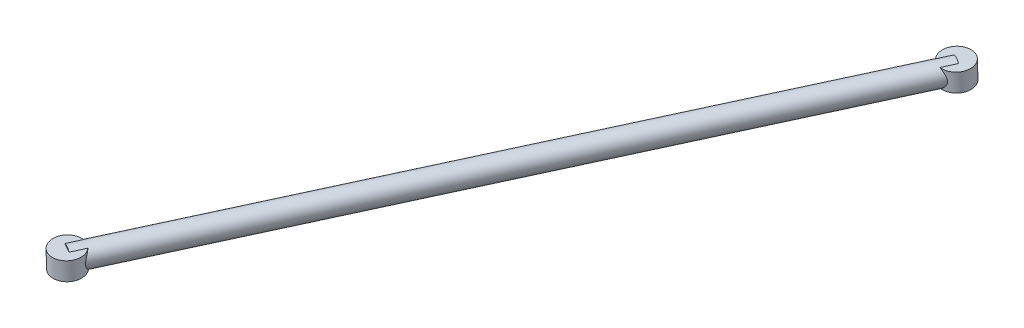
ISO-10303-21;
HEADER;
FILE_DESCRIPTION(('STEP AP214'),'2;1');
FILE_NAME('part.step','',(''),(''),'','','');
FILE_SCHEMA(('AUTOMOTIVE_DESIGN { 1 0 10303 214 1 1 1 1 }'));
ENDSEC;
DATA;
#1=APPLICATION_CONTEXT('core data for automotive mechanical design processes');
#2=APPLICATION_PROTOCOL_DEFINITION('international standard','automotive_design',2000,#1);
#3=PRODUCT_CONTEXT('',#1,'mechanical');
#4=PRODUCT('Part','Part','',(#3));
#5=PRODUCT_RELATED_PRODUCT_CATEGORY('part','',(#4));
#6=PRODUCT_DEFINITION_FORMATION('','',#4);
#7=PRODUCT_DEFINITION_CONTEXT('part definition',#1,'design');
#8=PRODUCT_DEFINITION('design','',#6,#7);
#9=PRODUCT_DEFINITION_SHAPE('','',#8);
#10=(LENGTH_UNIT() NAMED_UNIT(*) SI_UNIT(.MILLI.,.METRE.));
#11=(NAMED_UNIT(*) PLANE_ANGLE_UNIT() SI_UNIT($,.RADIAN.));
#12=(NAMED_UNIT(*) SI_UNIT($,.STERADIAN.) SOLID_ANGLE_UNIT());
#13=UNCERTAINTY_MEASURE_WITH_UNIT(LENGTH_MEASURE(1.E-05),#10,'distance_accuracy_value','');
#14=(GEOMETRIC_REPRESENTATION_CONTEXT(3) GLOBAL_UNCERTAINTY_ASSIGNED_CONTEXT((#13)) GLOBAL_UNIT_ASSIGNED_CONTEXT((#10,
#11,#12)) REPRESENTATION_CONTEXT('',''));
#15=CARTESIAN_POINT('',(0.,0.,0.));
#16=DIRECTION('',(0.,0.,1.));
#17=DIRECTION('',(1.,0.,0.));
#18=AXIS2_PLACEMENT_3D('',#15,#16,#17);
#19=CARTESIAN_POINT('',(-535.6,-114.51,-83.23));
#20=DIRECTION('',(0.464028683221349,0.0373067621610558,-0.885034229080954));
#21=DIRECTION('',(-0.885650765612241,0.,-0.464351936972866));
#22=AXIS2_PLACEMENT_3D('',#19,#20,#21);
#23=CYLINDRICAL_SURFACE('',#22,7.99999999999999);
#24=CARTESIAN_POINT('',(-527.527885217287,-121.275148551619,-90.9159437152939));
#25=CARTESIAN_POINT('',(-527.375216967127,-121.16999834848,-90.7415729183805));
#26=CARTESIAN_POINT('',(-527.230713424284,-121.056049329631,-90.5655522286834));
#27=CARTESIAN_POINT('',(-526.957681962772,-120.81185477697,-90.212711093261));
#28=CARTESIAN_POINT('',(-526.829140586321,-120.681623159602,-90.0358914533091));
#29=CARTESIAN_POINT('',(-526.587030323763,-120.405535202328,-89.6830775517052));
#30=CARTESIAN_POINT('',(-526.473511318909,-120.259629585795,-89.5070878230809));
#31=CARTESIAN_POINT('',(-526.261190648435,-119.953373275566,-89.1587749783426));
#32=CARTESIAN_POINT('',(-526.162392259245,-119.79301937876,-88.9864526857994));
#33=CARTESIAN_POINT('',(-525.979000634195,-119.458950893481,-88.6483799497242));
#34=CARTESIAN_POINT('',(-525.894368635894,-119.285274724236,-88.4826125535662));
#35=CARTESIAN_POINT('',(-525.738139016313,-118.92448603525,-88.1597396815241));
#36=CARTESIAN_POINT('',(-525.666542438499,-118.737372441533,-88.0026348997711));
#37=CARTESIAN_POINT('',(-525.535660945902,-118.35011111088,-87.700332495782));
#38=CARTESIAN_POINT('',(-525.476357867854,-118.149983185332,-87.5551175016211));
#39=CARTESIAN_POINT('',(-525.369187165174,-117.736726806719,-87.2800177749206));
#40=CARTESIAN_POINT('',(-525.321314214353,-117.523604467116,-87.1501259164655));
#41=CARTESIAN_POINT('',(-525.220905340081,-117.005163343979,-86.8664856557675));
#42=CARTESIAN_POINT('',(-525.172888371712,-116.694260713984,-86.7209672018812));
#43=CARTESIAN_POINT('',(-525.114725832974,-116.21294777,-86.5391840975553));
#44=CARTESIAN_POINT('',(-525.097653952323,-116.050103274001,-86.4846905484392));
#45=CARTESIAN_POINT('',(-525.067983414312,-115.720126230593,-86.3892391182557));
#46=CARTESIAN_POINT('',(-525.055382482164,-115.552995910332,-86.3482743545684));
#47=CARTESIAN_POINT('',(-525.034489759088,-115.214073448259,-86.2807933711694));
#48=CARTESIAN_POINT('',(-525.026235723574,-115.042253669066,-86.2544036513258));
#49=CARTESIAN_POINT('',(-525.014177727793,-114.696762787163,-86.2173817185584));
#50=CARTESIAN_POINT('',(-525.01037367745,-114.523091721997,-86.2067491866789));
#51=CARTESIAN_POINT('',(-525.007241492019,-114.175411062443,-86.2013874072575));
#52=CARTESIAN_POINT('',(-525.007914905922,-114.00140137172,-86.2066636630577));
#53=CARTESIAN_POINT('',(-525.013812077609,-113.654628526125,-86.2326269089957));
#54=CARTESIAN_POINT('',(-525.019035874906,-113.48186538209,-86.2533140329538));
#55=CARTESIAN_POINT('',(-525.033395031565,-113.155944826445,-86.3062858622486));
#56=CARTESIAN_POINT('',(-525.042090445484,-113.002544148725,-86.3372148850445));
#57=CARTESIAN_POINT('',(-525.063369965508,-112.69853683852,-86.4097276529701));
#58=CARTESIAN_POINT('',(-525.075955471115,-112.547931232294,-86.4513152317032));
#59=CARTESIAN_POINT('',(-525.119761695371,-112.101019206346,-86.5904786707225));
#60=CARTESIAN_POINT('',(-525.157029450102,-111.809681115766,-86.7024441236241));
#61=CARTESIAN_POINT('',(-525.239092568228,-111.303499593709,-86.9289215766435));
#62=CARTESIAN_POINT('',(-525.280617075135,-111.085533277276,-87.0378614444939));
#63=CARTESIAN_POINT('',(-525.375117139174,-110.660033124723,-87.2704281836567));
#64=CARTESIAN_POINT('',(-525.428097877762,-110.452504061716,-87.3940616892163));
#65=CARTESIAN_POINT('',(-525.546322468348,-110.048113734813,-87.653031449403));
#66=CARTESIAN_POINT('',(-525.611584958013,-109.851269277639,-87.7883853190047));
#67=CARTESIAN_POINT('',(-525.755089913837,-109.468989712555,-88.0679827774139));
#68=CARTESIAN_POINT('',(-525.833331161646,-109.283553535957,-88.2122255309996));
#69=CARTESIAN_POINT('',(-526.001963212901,-108.928032829871,-88.5045188959517));
#70=CARTESIAN_POINT('',(-526.092095897669,-108.757724094072,-88.6524456805632));
#71=CARTESIAN_POINT('',(-526.286290163929,-108.429377870879,-88.952649738329));
#72=CARTESIAN_POINT('',(-526.390348795014,-108.271337795374,-89.1049260846071));
#73=CARTESIAN_POINT('',(-526.612772660962,-107.968823639291,-89.4115832164398));
#74=CARTESIAN_POINT('',(-526.731101481504,-107.824316633677,-89.5659577896629));
#75=CARTESIAN_POINT('',(-526.982804637205,-107.54955262444,-89.8753924805938));
#76=CARTESIAN_POINT('',(-527.116190632637,-107.419306820582,-90.0304530390079));
#77=CARTESIAN_POINT('',(-527.257280147067,-107.296869973545,-90.1848388523638));
#78=B_SPLINE_CURVE_WITH_KNOTS('',3,(#24,#25,#26,#27,#28,#29,#30,#31,#32,#33,#34,#35,#36,#37,#38,
#39,#40,#41,#42,#43,#44,#45,#46,#47,#48,#49,#50,#51,#52,#53,#54,#55,#56,#57,#58,#59,#60,#61,#62,
#63,#64,#65,#66,#67,#68,#69,#70,#71,#72,#73,#74,#75,#76,#77),.UNSPECIFIED.,.F.,.F.,(4,2,2,2,2,2,
2,2,2,2,2,2,2,2,2,2,2,2,2,2,2,2,2,2,2,2,4),(0.,0.763017342065591,1.52538694865108,
2.29022764606419,3.05523832385196,3.81812027380768,4.58106326455515,5.3428708678139,
6.104322789496,7.13972593898703,7.65690353137052,8.17381760861127,8.6951502840498,
9.21647240657152,9.73797489124056,10.2594819044262,10.7292013609395,11.1990900009191,
12.1390591859545,12.8797532323706,13.6207829853052,14.3629464602411,15.1050403056593,
15.8330818833562,16.5609694587008,17.287037440532,18.0136715971829),.UNSPECIFIED.);
#79=CARTESIAN_POINT('',(-527.527885217287,-121.275148551619,-90.9159437152939));
#80=VERTEX_POINT('',#79);
#81=CARTESIAN_POINT('',(-527.257280147067,-107.296869973545,-90.1848388523638));
#82=VERTEX_POINT('',#81);
#83=EDGE_CURVE('E234',#80,#82,#78,.T.);
#84=ORIENTED_EDGE('',*,*,#83,.F.);
#85=CARTESIAN_POINT('',(-525.605809580209,-121.120493383174,-94.5812600121603));
#86=CARTESIAN_POINT('',(-526.923411805572,-121.226511061254,-92.0686487210002));
#87=CARTESIAN_POINT('',(-528.241014048009,-121.332528738536,-89.5560374387595));
#88=CARTESIAN_POINT('',(-530.876218567029,-121.544564091501,-84.5308148921169));
#89=CARTESIAN_POINT('',(-532.193820843613,-121.650581767185,-82.0182036277149));
#90=CARTESIAN_POINT('',(-533.511423137269,-121.75659944207,-79.5055923722324));
#91=B_SPLINE_CURVE_WITH_KNOTS('',3,(#85,#86,#87,#88,#89,#90),.UNSPECIFIED.,.F.,.F.,(4,2,4),(0.,
8.51732222328871,17.0346444465774),.UNSPECIFIED.);
#92=CARTESIAN_POINT('',(-532.305987571475,-121.659606990461,-81.8043064836089));
#93=VERTEX_POINT('',#92);
#94=EDGE_CURVE('E145',#80,#93,#91,.T.);
#95=ORIENTED_EDGE('',*,*,#94,.T.);
#96=CARTESIAN_POINT('',(-535.6,-114.51,-83.23));
#97=DIRECTION('',(0.46402868322135,0.0373067621610557,-0.885034229080954));
#98=DIRECTION('',(-0.88565076561224,0.,-0.464351936972866));
#99=AXIS2_PLACEMENT_3D('',#96,#97,#98);
#100=CIRCLE('',#99,7.99999999999999);
#101=CARTESIAN_POINT('',(-539.16587162213,-121.338612903503,-85.3874534499272));
#102=VERTEX_POINT('',#101);
#103=EDGE_CURVE('E209',#93,#102,#100,.T.);
#104=ORIENTED_EDGE('',*,*,#103,.T.);
#105=CARTESIAN_POINT('',(-542.249262381519,-121.586813490172,-79.505592372232));
#106=CARTESIAN_POINT('',(-540.932100647346,-121.480787252857,-82.0182036633885));
#107=CARTESIAN_POINT('',(-539.614938896096,-121.374761016341,-84.5308149456274));
#108=CARTESIAN_POINT('',(-536.980615359446,-121.162708544907,-89.5560374922698));
#109=CARTESIAN_POINT('',(-535.663453574046,-121.056682309989,-92.0686487566733));
#110=CARTESIAN_POINT('',(-534.34629177157,-120.950656075869,-94.5812600121591));
#111=B_SPLINE_CURVE_WITH_KNOTS('',3,(#105,#106,#107,#108,#109,#110),.UNSPECIFIED.,.F.,.F.,(4,2,
4),(0.,8.51670997960846,17.0334199592169),.UNSPECIFIED.);
#112=CARTESIAN_POINT('',(-534.389023241594,-120.954095787557,-94.4997456740078));
#113=VERTEX_POINT('',#112);
#114=EDGE_CURVE('E240',#102,#113,#111,.T.);
#115=ORIENTED_EDGE('',*,*,#114,.T.);
#116=CARTESIAN_POINT('',(-534.115909924604,-106.975934577704,-93.7673306698655));
#117=CARTESIAN_POINT('',(-534.342408282804,-107.08697114778,-93.800913499756));
#118=CARTESIAN_POINT('',(-534.565311268226,-107.20717438187,-93.8274364813404));
#119=CARTESIAN_POINT('',(-535.002119177237,-107.464439135144,-93.8679829011694));
#120=CARTESIAN_POINT('',(-535.216031583525,-107.601486247056,-93.8820169382076));
#121=CARTESIAN_POINT('',(-535.634114657782,-107.891624281577,-93.8992849186253));
#122=CARTESIAN_POINT('',(-535.838251669916,-108.044765539055,-93.9024838721228));
#123=CARTESIAN_POINT('',(-536.234640013448,-108.365720544914,-93.8998225493848));
#124=CARTESIAN_POINT('',(-536.426888691802,-108.533537548361,-93.8939602585415));
#125=CARTESIAN_POINT('',(-536.797443050142,-108.882552159916,-93.8751705304315));
#126=CARTESIAN_POINT('',(-536.975786082447,-109.063711187852,-93.8622628217905));
#127=CARTESIAN_POINT('',(-537.317478002382,-109.439306564377,-93.8315320883297));
#128=CARTESIAN_POINT('',(-537.48082569222,-109.633743971449,-93.8137086713099));
#129=CARTESIAN_POINT('',(-537.790289285312,-110.03525676333,-93.7755507573749));
#130=CARTESIAN_POINT('',(-537.936430363266,-110.242312994798,-93.7552200204072));
#131=CARTESIAN_POINT('',(-538.209169972207,-110.668772660287,-93.7147030430963));
#132=CARTESIAN_POINT('',(-538.335777581919,-110.888170293201,-93.694516739809));
#133=CARTESIAN_POINT('',(-538.608122423583,-111.420383511729,-93.6505333179564));
#134=CARTESIAN_POINT('',(-538.744327816088,-111.738386522499,-93.6280539912031));
#135=CARTESIAN_POINT('',(-538.910247648475,-112.228390334609,-93.6046070384433));
#136=CARTESIAN_POINT('',(-538.959141139915,-112.393804338084,-93.5985038893332));
#137=CARTESIAN_POINT('',(-539.043113453196,-112.72817391574,-93.590574515162));
#138=CARTESIAN_POINT('',(-539.078199303758,-112.897127641786,-93.5887461117112));
#139=CARTESIAN_POINT('',(-539.133886511312,-113.238885843293,-93.5900440002986));
#140=CARTESIAN_POINT('',(-539.154361314968,-113.411710901017,-93.5932128369184));
#141=CARTESIAN_POINT('',(-539.179765677628,-113.758325168549,-93.6049469177375));
#142=CARTESIAN_POINT('',(-539.18469555274,-113.932114358679,-93.6135120521978));
#143=CARTESIAN_POINT('',(-539.178926641949,-114.279138376951,-93.6360012663199));
#144=CARTESIAN_POINT('',(-539.168222481065,-114.452372993908,-93.6499271878078));
#145=CARTESIAN_POINT('',(-539.13160171477,-114.796741422635,-93.6826938027065));
#146=CARTESIAN_POINT('',(-539.105684979233,-114.967875216423,-93.7015345381571));
#147=CARTESIAN_POINT('',(-539.04277328947,-115.289928692608,-93.7412787948852));
#148=CARTESIAN_POINT('',(-539.007136872182,-115.441165691304,-93.7617906583905));
#149=CARTESIAN_POINT('',(-538.924993724361,-115.740285942367,-93.8054742937801));
#150=CARTESIAN_POINT('',(-538.878483083401,-115.888167967232,-93.8286470209962));
#151=CARTESIAN_POINT('',(-538.723845752334,-116.326183077776,-93.9010342582956));
#152=CARTESIAN_POINT('',(-538.600626500177,-116.61062241905,-93.9531095200787));
#153=CARTESIAN_POINT('',(-538.350450992499,-117.103294189808,-94.0474700860873));
#154=CARTESIAN_POINT('',(-538.229828319921,-117.314895967936,-94.0894896503542));
#155=CARTESIAN_POINT('',(-537.970360627103,-117.727125445603,-94.1717605398698));
#156=CARTESIAN_POINT('',(-537.831507372368,-117.927748127673,-94.2120110550324));
#157=CARTESIAN_POINT('',(-537.53757540914,-118.318010460194,-94.2883708337011));
#158=CARTESIAN_POINT('',(-537.382472171887,-118.507632815789,-94.3244736590814));
#159=CARTESIAN_POINT('',(-537.057968514987,-118.875365666591,-94.3903066141357));
#160=CARTESIAN_POINT('',(-536.888569437102,-119.053477239399,-94.4200373409497));
#161=CARTESIAN_POINT('',(-536.540233504806,-119.394587050197,-94.470671637568));
#162=CARTESIAN_POINT('',(-536.361535916194,-119.557806511136,-94.4917306902111));
#163=CARTESIAN_POINT('',(-535.993058206202,-119.872204705024,-94.5240653739872));
#164=CARTESIAN_POINT('',(-535.803280434778,-120.023385975147,-94.5353430716264));
#165=CARTESIAN_POINT('',(-535.414318102559,-120.312577495223,-94.5464461560329));
#166=CARTESIAN_POINT('',(-535.21515830907,-120.450619804822,-94.5463001737558));
#167=CARTESIAN_POINT('',(-534.80819902731,-120.71297205178,-94.5330996302288));
#168=CARTESIAN_POINT('',(-534.600392928083,-120.837271205351,-94.5200350109703));
#169=CARTESIAN_POINT('',(-534.389023241594,-120.954095787557,-94.4997456740078));
#170=B_SPLINE_CURVE_WITH_KNOTS('',3,(#116,#117,#118,#119,#120,#121,#122,#123,#124,#125,#126,
#127,#128,#129,#130,#131,#132,#133,#134,#135,#136,#137,#138,#139,#140,#141,#142,#143,#144,#145,
#146,#147,#148,#149,#150,#151,#152,#153,#154,#155,#156,#157,#158,#159,#160,#161,#162,#163,#164,
#165,#166,#167,#168,#169),.UNSPECIFIED.,.F.,.F.,(4,2,2,2,2,2,2,2,2,2,2,2,2,2,2,2,2,2,2,2,2,2,2,
2,2,2,4),(0.,0.762953061553566,1.52525802070634,2.29002236651429,3.05495676864401,
3.81776010385375,4.58062431696874,5.34235814945934,6.10373687133438,7.13931927468668,
7.65658625494797,8.17358958096663,8.69501829106263,9.21643639772938,9.73803381010948,
10.2596356842124,10.729348709279,11.1992309061377,12.1391873862654,12.879816480366,
13.6207812644577,14.3628810779213,15.1049113175282,15.8329875081597,16.5609098406965,
17.2870078536674,18.0136716271703),.UNSPECIFIED.);
#171=CARTESIAN_POINT('',(-534.115909924604,-106.975934577704,-93.7673306698655));
#172=VERTEX_POINT('',#171);
#173=EDGE_CURVE('E132',#172,#113,#170,.T.);
#174=ORIENTED_EDGE('',*,*,#173,.F.);
#175=CARTESIAN_POINT('',(-541.594702764301,-107.57769751709,-79.5055923722315));
#176=CARTESIAN_POINT('',(-540.341096981445,-107.476829162243,-81.8961650950413));
#177=CARTESIAN_POINT('',(-539.087491183128,-107.375960808118,-84.2867378097736));
#178=CARTESIAN_POINT('',(-536.580279555571,-107.174224101317,-89.0678832230832));
#179=CARTESIAN_POINT('',(-535.32667372633,-107.07335574864,-91.4584559216605));
#180=CARTESIAN_POINT('',(-534.073067881628,-106.972487396687,-93.8490286121602));
#181=B_SPLINE_CURVE_WITH_KNOTS('',3,(#175,#176,#177,#178,#179,#180),.UNSPECIFIED.,.F.,.F.,(4,2,
4),(0.,8.10363242266977,16.2072648453396),.UNSPECIFIED.);
#182=CARTESIAN_POINT('',(-538.894012428525,-107.360393009539,-84.655693516391));
#183=VERTEX_POINT('',#182);
#184=EDGE_CURVE('E219',#183,#172,#181,.T.);
#185=ORIENTED_EDGE('',*,*,#184,.F.);
#186=CARTESIAN_POINT('',(-532.03412837787,-107.681387096497,-81.0725465500727));
#187=VERTEX_POINT('',#186);
#188=EDGE_CURVE('E210',#183,#187,#100,.T.);
#189=ORIENTED_EDGE('',*,*,#188,.T.);
#190=CARTESIAN_POINT('',(-525.336437695948,-107.142249855229,-93.8490286121603));
#191=CARTESIAN_POINT('',(-526.589624302703,-107.243126355135,-91.4584558893537));
#192=CARTESIAN_POINT('',(-527.842810924921,-107.344002854318,-89.067883174623));
#193=CARTESIAN_POINT('',(-530.349184200286,-107.545755851236,-84.2867377613137));
#194=CARTESIAN_POINT('',(-531.602370853432,-107.646632348972,-81.896165062735));
#195=CARTESIAN_POINT('',(-532.855557522043,-107.747508845984,-79.5055923722323));
#196=B_SPLINE_CURVE_WITH_KNOTS('',3,(#190,#191,#192,#193,#194,#195),.UNSPECIFIED.,.F.,.F.,(4,2,
4),(0.,8.1030498050724,16.2060996101447),.UNSPECIFIED.);
#197=EDGE_CURVE('E148',#82,#187,#196,.T.);
#198=ORIENTED_EDGE('',*,*,#197,.F.);
#199=EDGE_LOOP('',(#84,#95,#104,#115,#174,#185,#189,#198));
#200=FACE_BOUND('',#199,.T.);
#201=CARTESIAN_POINT('',(-316.903419332778,-103.469730383984,-509.303460875474));
#202=CARTESIAN_POINT('',(-317.051571936891,-103.341162818868,-509.465570758248));
#203=CARTESIAN_POINT('',(-317.191223018954,-103.203994638612,-509.628421877129));
#204=CARTESIAN_POINT('',(-317.453930209025,-102.913997565729,-509.953255561114));
#205=CARTESIAN_POINT('',(-317.577000313128,-102.761182075322,-510.115238746513));
#206=CARTESIAN_POINT('',(-317.807574887584,-102.440691490882,-510.436786325185));
#207=CARTESIAN_POINT('',(-317.915027858437,-102.272970046766,-510.596341228824));
#208=CARTESIAN_POINT('',(-318.114676120865,-101.924124785105,-510.91033238341));
#209=CARTESIAN_POINT('',(-318.206868014362,-101.742997995642,-511.064767488262));
#210=CARTESIAN_POINT('',(-318.376552970705,-101.368704047807,-511.365742261934));
#211=CARTESIAN_POINT('',(-318.454086268196,-101.175571839106,-511.512302728388));
#212=CARTESIAN_POINT('',(-318.595625357119,-100.777364713356,-511.795441169107));
#213=CARTESIAN_POINT('',(-318.659630068454,-100.572288844412,-511.932018345756));
#214=CARTESIAN_POINT('',(-318.774856457116,-100.150903610277,-512.192006039456));
#215=CARTESIAN_POINT('',(-318.826096935242,-99.9346113406412,-512.315435766405));
#216=CARTESIAN_POINT('',(-318.916678100539,-99.491150878473,-512.545727345031));
#217=CARTESIAN_POINT('',(-318.956024324101,-99.26398780316,-512.652596893609));
#218=CARTESIAN_POINT('',(-319.03577861554,-98.7152988463276,-512.880493511089));
#219=CARTESIAN_POINT('',(-319.071465826541,-98.3892524621917,-512.992758127525));
#220=CARTESIAN_POINT('',(-319.110631127407,-97.8896520880649,-513.123327957238));
#221=CARTESIAN_POINT('',(-319.121290205303,-97.7214514352367,-513.160537422948));
#222=CARTESIAN_POINT('',(-319.137997604419,-97.3823707365091,-513.221055213763));
#223=CARTESIAN_POINT('',(-319.144048273001,-97.2114921000122,-513.244370614702));
#224=CARTESIAN_POINT('',(-319.151690618087,-96.8667704954943,-513.276151904067));
#225=CARTESIAN_POINT('',(-319.153243683686,-96.6929146737005,-513.284488977017));
#226=CARTESIAN_POINT('',(-319.15186146274,-96.3451763067465,-513.285302495281));
#227=CARTESIAN_POINT('',(-319.148926267467,-96.1712937622016,-513.277779263124));
#228=CARTESIAN_POINT('',(-319.138600858221,-95.82502280801,-513.246883472631));
#229=CARTESIAN_POINT('',(-319.131209112605,-95.6526349327284,-513.223505464923));
#230=CARTESIAN_POINT('',(-319.111956846124,-95.3108809284708,-513.161554514297));
#231=CARTESIAN_POINT('',(-319.100096287035,-95.1415148253552,-513.122981441405));
#232=CARTESIAN_POINT('',(-319.073249898878,-94.8236613708604,-513.036353551578));
#233=CARTESIAN_POINT('',(-319.05869234637,-94.6747730926158,-512.989623706231));
#234=CARTESIAN_POINT('',(-319.025821887602,-94.3810346597212,-512.885864630541));
#235=CARTESIAN_POINT('',(-319.007507630703,-94.2361859787543,-512.828831696834));
#236=CARTESIAN_POINT('',(-318.946739936582,-93.8082502908962,-512.643931225294));
#237=CARTESIAN_POINT('',(-318.898466684602,-93.5318355792821,-512.50227969939));
#238=CARTESIAN_POINT('',(-318.797367630713,-93.0556009699619,-512.224436691043));
#239=CARTESIAN_POINT('',(-318.747678070319,-92.8519686023507,-512.093457356265));
#240=CARTESIAN_POINT('',(-318.637294428904,-92.4570455554556,-511.818000751793));
#241=CARTESIAN_POINT('',(-318.576595370292,-92.2657605118734,-511.673517391071));
#242=CARTESIAN_POINT('',(-318.443384538214,-91.8954854430671,-511.374046644797));
#243=CARTESIAN_POINT('',(-318.370854812138,-91.716514700536,-511.219043507924));
#244=CARTESIAN_POINT('',(-318.213289582436,-91.3713392634913,-510.90140984421));
#245=CARTESIAN_POINT('',(-318.128255251898,-91.2051333736986,-510.738780033821));
#246=CARTESIAN_POINT('',(-317.946640344816,-90.8888215190313,-510.411334682809));
#247=CARTESIAN_POINT('',(-317.850306970112,-90.7384715673503,-510.246617757645));
#248=CARTESIAN_POINT('',(-317.644206596072,-90.4509595713022,-509.914161715806));
#249=CARTESIAN_POINT('',(-317.53444243985,-90.3137947467634,-509.74642324514));
#250=CARTESIAN_POINT('',(-317.301148919252,-90.0537204000155,-509.410295101198));
#251=CARTESIAN_POINT('',(-317.177654742746,-89.930776012636,-509.241908113545));
#252=CARTESIAN_POINT('',(-316.916185386563,-89.6997014905625,-508.905965998129));
#253=CARTESIAN_POINT('',(-316.778198998572,-89.5915829734605,-508.738411620764));
#254=CARTESIAN_POINT('',(-316.632815536967,-89.4914519064078,-508.572356838366));
#255=B_SPLINE_CURVE_WITH_KNOTS('',3,(#201,#202,#203,#204,#205,#206,#207,#208,#209,#210,#211,
#212,#213,#214,#215,#216,#217,#218,#219,#220,#221,#222,#223,#224,#225,#226,#227,#228,#229,#230,
#231,#232,#233,#234,#235,#236,#237,#238,#239,#240,#241,#242,#243,#244,#245,#246,#247,#248,#249,
#250,#251,#252,#253,#254),.UNSPECIFIED.,.F.,.F.,(4,2,2,2,2,2,2,2,2,2,2,2,2,2,2,2,2,2,2,2,2,2,2,
2,2,2,4),(0.,0.76295302837185,1.52525795414614,2.29002226041774,3.05495662305211,
3.81775991751966,4.58062408980695,5.34235788410578,6.10373656808825,7.1393190657309,
7.65658609300859,8.17358946597033,8.69501822660268,9.21643638377909,9.73803384611203,
10.2596357701322,10.7293487915456,11.1992309847448,12.139187457664,12.8798165169627,
13.6207812662627,14.3628810455268,15.1049112508853,15.8329873688581,16.5609096288344,
17.2870075663248,18.0136712638583),.UNSPECIFIED.);
#256=CARTESIAN_POINT('',(-316.903419332778,-103.469730383984,-509.303460875474));
#257=VERTEX_POINT('',#256);
#258=CARTESIAN_POINT('',(-316.632815536967,-89.4914519064078,-508.572356838366));
#259=VERTEX_POINT('',#258);
#260=EDGE_CURVE('E12',#257,#259,#255,.T.);
#261=ORIENTED_EDGE('',*,*,#260,.F.);
#262=CARTESIAN_POINT('',(-318.824261153416,-103.624350642761,-505.639271712893));
#263=CARTESIAN_POINT('',(-317.571074782147,-103.523474037059,-508.029844381556));
#264=CARTESIAN_POINT('',(-316.317888395382,-103.422597432082,-510.420417042128));
#265=CARTESIAN_POINT('',(-313.811515590861,-103.220844223578,-515.201562347086));
#266=CARTESIAN_POINT('',(-312.558329173106,-103.119967620051,-517.592134991473));
#267=CARTESIAN_POINT('',(-311.305142739855,-103.019091017249,-519.982707627767));
#268=B_SPLINE_CURVE_WITH_KNOTS('',3,(#262,#263,#264,#265,#266,#267),.UNSPECIFIED.,.F.,.F.,(4,2,
4),(0.,8.10304934539383,16.2060986907876),.UNSPECIFIED.);
#269=CARTESIAN_POINT('',(-312.126571722338,-103.085212835481,-518.415753499599));
#270=VERTEX_POINT('',#269);
#271=EDGE_CURVE('E192',#257,#270,#268,.T.);
#272=ORIENTED_EDGE('',*,*,#271,.T.);
#273=CARTESIAN_POINT('',(-308.5607,-96.2566,-516.2583));
#274=DIRECTION('',(0.46402868322135,0.0373067621610557,-0.885034229080954));
#275=DIRECTION('',(-0.88565076561224,0.,-0.464351936972866));
#276=AXIS2_PLACEMENT_3D('',#273,#274,#275);
#277=CIRCLE('',#276,7.99999999999999);
#278=CARTESIAN_POINT('',(-305.266687725017,-103.40620707799,-514.832606567801));
#279=VERTEX_POINT('',#278);
#280=EDGE_CURVE('E133',#279,#270,#277,.T.);
#281=ORIENTED_EDGE('',*,*,#280,.F.);
#282=CARTESIAN_POINT('',(-302.565996966555,-103.188902358891,-519.982707627768));
#283=CARTESIAN_POINT('',(-303.819602937686,-103.2897708113,-517.592134959101));
#284=CARTESIAN_POINT('',(-305.073208924309,-103.390639262984,-515.201562298528));
#285=CARTESIAN_POINT('',(-307.580420928542,-103.592376164902,-510.42041699357));
#286=CARTESIAN_POINT('',(-308.834026946152,-103.693244615137,-508.029844349184));
#287=CARTESIAN_POINT('',(-310.087632979254,-103.794113064646,-505.639271712893));
#288=B_SPLINE_CURVE_WITH_KNOTS('',3,(#282,#283,#284,#285,#286,#287),.UNSPECIFIED.,.F.,.F.,(4,2,
4),(0.,8.10363255197994,16.2072651039598),.UNSPECIFIED.);
#289=CARTESIAN_POINT('',(-310.044790878062,-103.790665876129,-505.720969752073));
#290=VERTEX_POINT('',#289);
#291=EDGE_CURVE('E186',#279,#290,#288,.T.);
#292=ORIENTED_EDGE('',*,*,#291,.T.);
#293=CARTESIAN_POINT('',(-309.771675660917,-89.812504915378,-504.988553915573));
#294=CARTESIAN_POINT('',(-309.549718692296,-89.9351849686998,-504.967245455477));
#295=CARTESIAN_POINT('',(-309.331698200369,-90.0660975871964,-504.953907740247));
#296=CARTESIAN_POINT('',(-308.905281858601,-90.3430214265694,-504.94140393851));
#297=CARTESIAN_POINT('',(-308.696877995395,-90.4890197357075,-504.94222583114));
#298=CARTESIAN_POINT('',(-308.290406742517,-90.7954567967947,-504.956263954659));
#299=CARTESIAN_POINT('',(-308.092375046427,-90.9559408212369,-504.969520351185));
#300=CARTESIAN_POINT('',(-307.708744381879,-91.2900835158672,-505.006547916067));
#301=CARTESIAN_POINT('',(-307.523148186286,-91.4637451060981,-505.0303214206));
#302=CARTESIAN_POINT('',(-307.166398054982,-91.8230884823778,-505.086260078542));
#303=CARTESIAN_POINT('',(-306.995205369163,-92.0087354762724,-505.118401697195));
#304=CARTESIAN_POINT('',(-306.668314571355,-92.3921308620705,-505.188924633898));
#305=CARTESIAN_POINT('',(-306.51261770024,-92.5898802210616,-505.227306451002));
#306=CARTESIAN_POINT('',(-306.218937006526,-92.9970081380065,-505.30784582909));
#307=CARTESIAN_POINT('',(-306.080927168662,-93.2063689517521,-505.34999768611));
#308=CARTESIAN_POINT('',(-305.824924520457,-93.6366193536854,-505.435399812427));
#309=CARTESIAN_POINT('',(-305.706922394408,-93.8575035135407,-505.478649559695));
#310=CARTESIAN_POINT('',(-305.455487548994,-94.3924084683813,-505.578510013248));
#311=CARTESIAN_POINT('',(-305.331777221791,-94.7113467108415,-505.634329503586));
#312=CARTESIAN_POINT('',(-305.185093367907,-95.2022449920591,-505.709114401637));
#313=CARTESIAN_POINT('',(-305.142690680567,-95.367872467258,-505.732542366036));
#314=CARTESIAN_POINT('',(-305.071833736351,-95.7025534623226,-505.775484872513));
#315=CARTESIAN_POINT('',(-305.043372383405,-95.8716051935324,-505.795001402496));
#316=CARTESIAN_POINT('',(-305.001080193844,-96.2134842298649,-505.829478735806));
#317=CARTESIAN_POINT('',(-304.987376498855,-96.3863314562907,-505.844399170628));
#318=CARTESIAN_POINT('',(-304.975545945371,-96.7329401108903,-505.868943262289));
#319=CARTESIAN_POINT('',(-304.977418771572,-96.9067015204879,-505.878567026341));
#320=CARTESIAN_POINT('',(-304.99676435403,-97.2536234582184,-505.892397560126));
#321=CARTESIAN_POINT('',(-305.014242507205,-97.4267837576644,-505.896602454579));
#322=CARTESIAN_POINT('',(-305.064321157982,-97.7709372755535,-505.899877217716));
#323=CARTESIAN_POINT('',(-305.096921786902,-97.9419304751652,-505.898947041809));
#324=CARTESIAN_POINT('',(-305.172410385612,-98.2636467586038,-505.892905674249));
#325=CARTESIAN_POINT('',(-305.21395530517,-98.414696539918,-505.888218844845));
#326=CARTESIAN_POINT('',(-305.30778093548,-98.7133177333941,-505.875829322617));
#327=CARTESIAN_POINT('',(-305.360065507658,-98.8608878731219,-505.868125544149));
#328=CARTESIAN_POINT('',(-305.531798045352,-99.2977141905925,-505.841545179836));
#329=CARTESIAN_POINT('',(-305.666109546606,-99.5810235705006,-505.819201295864));
#330=CARTESIAN_POINT('',(-305.935484551301,-100.070760258864,-505.776291704229));
#331=CARTESIAN_POINT('',(-306.064352034492,-100.280753435,-505.756353260004));
#332=CARTESIAN_POINT('',(-306.339865876895,-100.688939550126,-505.717057140214));
#333=CARTESIAN_POINT('',(-306.486520267597,-100.887127097731,-505.697699731969));
#334=CARTESIAN_POINT('',(-306.795607295418,-101.271522253104,-505.661929110819));
#335=CARTESIAN_POINT('',(-306.95806372882,-101.457711068555,-505.645520447624));
#336=CARTESIAN_POINT('',(-307.296803214615,-101.817424987701,-505.617815387743));
#337=CARTESIAN_POINT('',(-307.473084968368,-101.990951277863,-505.606518511569));
#338=CARTESIAN_POINT('',(-307.834549778842,-102.321667137242,-505.59111249624));
#339=CARTESIAN_POINT('',(-308.019501067773,-102.479103838802,-505.58687129954));
#340=CARTESIAN_POINT('',(-308.399987413885,-102.78055897582,-505.58684220517));
#341=CARTESIAN_POINT('',(-308.595520224009,-102.924580242597,-505.591052519565));
#342=CARTESIAN_POINT('',(-308.995449083201,-103.197972598892,-505.609471094092));
#343=CARTESIAN_POINT('',(-309.199821753826,-103.327379411266,-505.623654334811));
#344=CARTESIAN_POINT('',(-309.616637726308,-103.570861363813,-505.663409608551));
#345=CARTESIAN_POINT('',(-309.82908719723,-103.684924469931,-505.688990513727));
#346=CARTESIAN_POINT('',(-310.044790878062,-103.790665876129,-505.720969752073));
#347=B_SPLINE_CURVE_WITH_KNOTS('',3,(#293,#294,#295,#296,#297,#298,#299,#300,#301,#302,#303,
#304,#305,#306,#307,#308,#309,#310,#311,#312,#313,#314,#315,#316,#317,#318,#319,#320,#321,#322,
#323,#324,#325,#326,#327,#328,#329,#330,#331,#332,#333,#334,#335,#336,#337,#338,#339,#340,#341,
#342,#343,#344,#345,#346),.UNSPECIFIED.,.F.,.F.,(4,2,2,2,2,2,2,2,2,2,2,2,2,2,2,2,2,2,2,2,2,2,2,
2,2,2,4),(0.,0.763017384716419,1.5253870342654,2.29022778351283,3.05523851306725,
3.81812051672435,4.58106356129704,5.3428712145743,6.10432318584932,7.13972619712916,
7.65690372059942,8.17381772903394,8.69515033037571,9.21647237883983,9.73797479026487,
10.2594817302581,10.7292011920793,11.1990898373757,12.139059032927,12.8797531352848,
13.620782944203,14.3629464740551,15.1050403742683,15.8330818415041,16.5609693062902,
17.2870371806846,18.0136712299755),.UNSPECIFIED.);
#348=CARTESIAN_POINT('',(-309.771675660917,-89.812504915378,-504.988553915573));
#349=VERTEX_POINT('',#348);
#350=EDGE_CURVE('E75',#349,#290,#347,.T.);
#351=ORIENTED_EDGE('',*,*,#350,.F.);
#352=CARTESIAN_POINT('',(-301.911437603664,-89.1797865175639,-519.982707627768));
#353=CARTESIAN_POINT('',(-303.228599144311,-89.28581287041,-517.470096290751));
#354=CARTESIAN_POINT('',(-304.545760702069,-89.3918392224555,-514.957484962669));
#355=CARTESIAN_POINT('',(-307.180083851805,-89.6038919249455,-509.932262324378));
#356=CARTESIAN_POINT('',(-308.497245443783,-89.70991827539,-507.419651014168));
#357=CARTESIAN_POINT('',(-309.814407052871,-89.8159446250339,-504.907039712894));
#358=B_SPLINE_CURVE_WITH_KNOTS('',3,(#352,#353,#354,#355,#356,#357),.UNSPECIFIED.,.F.,.F.,(4,2,
4),(0.,8.51670984495134,17.0334196899027),.UNSPECIFIED.);
#359=CARTESIAN_POINT('',(-304.99482796191,-89.4279873788533,-514.100846343885));
#360=VERTEX_POINT('',#359);
#361=EDGE_CURVE('E136',#360,#349,#358,.T.);
#362=ORIENTED_EDGE('',*,*,#361,.F.);
#363=CARTESIAN_POINT('',(-311.85471259849,-89.1069931064313,-517.683993609589));
#364=VERTEX_POINT('',#363);
#365=EDGE_CURVE('E127',#364,#360,#277,.T.);
#366=ORIENTED_EDGE('',*,*,#365,.F.);
#367=CARTESIAN_POINT('',(-318.554891940628,-89.6461072629057,-504.907039712893));
#368=CARTESIAN_POINT('',(-317.237289463603,-89.5400894779447,-507.419651049913));
#369=CARTESIAN_POINT('',(-315.91968696947,-89.4340716937842,-509.932262377997));
#370=CARTESIAN_POINT('',(-313.284481946989,-89.2220361270644,-514.957485016288));
#371=CARTESIAN_POINT('',(-311.966879418641,-89.1160183445051,-517.470096326497));
#372=CARTESIAN_POINT('',(-310.649276873185,-89.0100005627464,-519.982707627768));
#373=B_SPLINE_CURVE_WITH_KNOTS('',3,(#367,#368,#369,#370,#371,#372),.UNSPECIFIED.,.F.,.F.,(4,2,
4),(0.,8.51732270740307,17.0346454148062),.UNSPECIFIED.);
#374=EDGE_CURVE('E82',#259,#364,#373,.T.);
#375=ORIENTED_EDGE('',*,*,#374,.F.);
#376=EDGE_LOOP('',(#261,#272,#281,#292,#351,#362,#366,#375));
#377=FACE_BOUND('',#376,.T.);
#378=ADVANCED_FACE('F61',(#200,#377),#23,.T.);
#379=CARTESIAN_POINT('',(-308.5607,-96.2566,-516.2583));
#380=DIRECTION('',(0.46402868322135,0.0373067621610557,-0.885034229080954));
#381=DIRECTION('',(-0.88565076561224,0.,-0.464351936972866));
#382=AXIS2_PLACEMENT_3D('',#379,#380,#381);
#383=PLANE('',#382);
#384=ORIENTED_EDGE('',*,*,#280,.T.);
#385=DIRECTION('',(0.885607306760895,-0.0414401827648095,0.462582327228497));
#386=VECTOR('',#385,1.);
#387=CARTESIAN_POINT('',(-308.696629723678,-103.245709956736,-516.6241800337));
#388=LINE('',#387,#386);
#389=EDGE_CURVE('E144',#270,#279,#388,.T.);
#390=ORIENTED_EDGE('',*,*,#389,.T.);
#391=EDGE_LOOP('',(#384,#390));
#392=FACE_BOUND('',#391,.T.);
#393=ADVANCED_FACE('F265',(#392),#383,.T.);
#394=CARTESIAN_POINT('',(-535.6,-114.51,-83.23));
#395=DIRECTION('',(0.46402868322135,0.0373067621610557,-0.885034229080954));
#396=DIRECTION('',(-0.88565076561224,0.,-0.464351936972866));
#397=AXIS2_PLACEMENT_3D('',#394,#395,#396);
#398=PLANE('',#397);
#399=DIRECTION('',(0.885607307157363,-0.0414401623796151,0.462582328295662));
#400=VECTOR('',#399,1.);
#401=CARTESIAN_POINT('',(-535.735929596803,-121.499109946982,-83.5958799667681));
#402=LINE('',#401,#400);
#403=EDGE_CURVE('E206',#102,#93,#402,.T.);
#404=ORIENTED_EDGE('',*,*,#403,.F.);
#405=ORIENTED_EDGE('',*,*,#103,.F.);
#406=EDGE_LOOP('',(#404,#405));
#407=FACE_BOUND('',#406,.T.);
#408=ADVANCED_FACE('F263',(#407),#398,.F.);
#409=ORIENTED_EDGE('',*,*,#188,.F.);
#410=DIRECTION('',(0.885607307157363,-0.0414401623796151,0.462582328295662));
#411=VECTOR('',#410,1.);
#412=CARTESIAN_POINT('',(-535.464070403197,-107.520890053018,-82.8641200332319));
#413=LINE('',#412,#411);
#414=EDGE_CURVE('E204',#183,#187,#413,.T.);
#415=ORIENTED_EDGE('',*,*,#414,.T.);
#416=EDGE_LOOP('',(#409,#415));
#417=FACE_BOUND('',#416,.T.);
#418=ADVANCED_FACE('F63',(#417),#398,.F.);
#419=DIRECTION('',(0.885607306760895,-0.0414401827648095,0.462582327228497));
#420=VECTOR('',#419,1.);
#421=CARTESIAN_POINT('',(-308.4247702802,-89.2674902426423,-515.892419976737));
#422=LINE('',#421,#420);
#423=EDGE_CURVE('E131',#364,#360,#422,.T.);
#424=ORIENTED_EDGE('',*,*,#423,.F.);
#425=ORIENTED_EDGE('',*,*,#365,.T.);
#426=EDGE_LOOP('',(#424,#425));
#427=FACE_BOUND('',#426,.T.);
#428=ADVANCED_FACE('F129',(#427),#383,.T.);
#429=CARTESIAN_POINT('',(-535.735806,-121.4991,-83.5961157));
#430=DIRECTION('',(0.0194008565914271,0.998442828764438,0.0523022413705713));
#431=DIRECTION('',(0.,-0.0523120872550541,0.998630785389185));
#432=AXIS2_PLACEMENT_3D('',#429,#430,#431);
#433=PLANE('',#432);
#434=ORIENTED_EDGE('',*,*,#114,.F.);
#435=ORIENTED_EDGE('',*,*,#403,.T.);
#436=ORIENTED_EDGE('',*,*,#94,.F.);
#437=CARTESIAN_POINT('',(-535.735806,-121.4991,-83.5961157));
#438=DIRECTION('',(0.0194008565914271,0.998442828764438,0.0523022413705713));
#439=DIRECTION('',(0.,-0.0523120872550541,0.998630785389185));
#440=AXIS2_PLACEMENT_3D('',#437,#438,#439);
#441=CIRCLE('',#440,11.);
#442=EDGE_CURVE('E198',#113,#80,#441,.T.);
#443=ORIENTED_EDGE('',*,*,#442,.F.);
#444=EDGE_LOOP('',(#434,#435,#436,#443));
#445=FACE_BOUND('',#444,.T.);
#446=ADVANCED_FACE('F166',(#445),#433,.F.);
#447=CARTESIAN_POINT('',(-535.464194,-107.5209,-82.8638843));
#448=DIRECTION('',(0.0194008565914271,0.998442828764438,0.0523022413705713));
#449=DIRECTION('',(0.,-0.0523120872550541,0.998630785389185));
#450=AXIS2_PLACEMENT_3D('',#447,#448,#449);
#451=PLANE('',#450);
#452=ORIENTED_EDGE('',*,*,#414,.F.);
#453=ORIENTED_EDGE('',*,*,#184,.T.);
#454=CARTESIAN_POINT('',(-535.464194,-107.5209,-82.8638843));
#455=DIRECTION('',(0.0194008565914271,0.998442828764438,0.0523022413705713));
#456=DIRECTION('',(0.,-0.0523120872550541,0.998630785389185));
#457=AXIS2_PLACEMENT_3D('',#454,#455,#456);
#458=CIRCLE('',#457,11.);
#459=EDGE_CURVE('E201',#172,#82,#458,.T.);
#460=ORIENTED_EDGE('',*,*,#459,.T.);
#461=ORIENTED_EDGE('',*,*,#197,.T.);
#462=EDGE_LOOP('',(#452,#453,#460,#461));
#463=FACE_BOUND('',#462,.T.);
#464=ADVANCED_FACE('F229',(#463),#451,.T.);
#465=CARTESIAN_POINT('',(-535.735806,-121.4991,-83.5961157));
#466=DIRECTION('',(0.0194008565914351,0.998442828764438,0.0523022413705735));
#467=DIRECTION('',(0.,-0.0523120872550563,0.998630785389184));
#468=AXIS2_PLACEMENT_3D('',#465,#466,#467);
#469=CYLINDRICAL_SURFACE('',#468,11.);
#470=ORIENTED_EDGE('',*,*,#442,.T.);
#471=ORIENTED_EDGE('',*,*,#83,.T.);
#472=ORIENTED_EDGE('',*,*,#459,.F.);
#473=ORIENTED_EDGE('',*,*,#173,.T.);
#474=EDGE_LOOP('',(#470,#471,#472,#473));
#475=FACE_BOUND('',#474,.T.);
#476=ADVANCED_FACE('F226',(#475),#469,.T.);
#477=CARTESIAN_POINT('',(-308.696506,-103.2457,-516.624416));
#478=DIRECTION('',(0.0194008568246633,0.998442826481947,0.052302284856486));
#479=DIRECTION('',(0.,-0.0523121307493918,0.998630783110784));
#480=AXIS2_PLACEMENT_3D('',#477,#478,#479);
#481=PLANE('',#480);
#482=ORIENTED_EDGE('',*,*,#271,.F.);
#483=CARTESIAN_POINT('',(-308.696506,-103.2457,-516.624416));
#484=DIRECTION('',(0.0194008568246633,0.998442826481947,0.052302284856486));
#485=DIRECTION('',(0.,-0.0523121307493918,0.998630783110784));
#486=AXIS2_PLACEMENT_3D('',#483,#484,#485);
#487=CIRCLE('',#486,11.);
#488=EDGE_CURVE('E390',#290,#257,#487,.T.);
#489=ORIENTED_EDGE('',*,*,#488,.F.);
#490=ORIENTED_EDGE('',*,*,#291,.F.);
#491=ORIENTED_EDGE('',*,*,#389,.F.);
#492=EDGE_LOOP('',(#482,#489,#490,#491));
#493=FACE_BOUND('',#492,.T.);
#494=ADVANCED_FACE('F171',(#493),#481,.F.);
#495=CARTESIAN_POINT('',(-308.424894,-89.2675002,-515.892184));
#496=DIRECTION('',(0.0194008568246633,0.998442826481947,0.052302284856486));
#497=DIRECTION('',(0.,-0.0523121307493918,0.998630783110784));
#498=AXIS2_PLACEMENT_3D('',#495,#496,#497);
#499=PLANE('',#498);
#500=CARTESIAN_POINT('',(-308.424894,-89.2675002,-515.892184));
#501=DIRECTION('',(0.0194008568246633,0.998442826481947,0.052302284856486));
#502=DIRECTION('',(0.,-0.0523121307493918,0.998630783110784));
#503=AXIS2_PLACEMENT_3D('',#500,#501,#502);
#504=CIRCLE('',#503,11.);
#505=EDGE_CURVE('E141',#349,#259,#504,.T.);
#506=ORIENTED_EDGE('',*,*,#505,.T.);
#507=ORIENTED_EDGE('',*,*,#374,.T.);
#508=ORIENTED_EDGE('',*,*,#423,.T.);
#509=ORIENTED_EDGE('',*,*,#361,.T.);
#510=EDGE_LOOP('',(#506,#507,#508,#509));
#511=FACE_BOUND('',#510,.T.);
#512=ADVANCED_FACE('F143',(#511),#499,.T.);
#513=CARTESIAN_POINT('',(-308.696506,-103.2457,-516.624416));
#514=DIRECTION('',(0.0194008568246672,0.998442826481947,0.0523022848564858));
#515=DIRECTION('',(0.,-0.0523121307493916,0.998630783110784));
#516=AXIS2_PLACEMENT_3D('',#513,#514,#515);
#517=CYLINDRICAL_SURFACE('',#516,11.);
#518=ORIENTED_EDGE('',*,*,#488,.T.);
#519=ORIENTED_EDGE('',*,*,#260,.T.);
#520=ORIENTED_EDGE('',*,*,#505,.F.);
#521=ORIENTED_EDGE('',*,*,#350,.T.);
#522=EDGE_LOOP('',(#518,#519,#520,#521));
#523=FACE_BOUND('',#522,.T.);
#524=ADVANCED_FACE('F161',(#523),#517,.T.);
#525=CLOSED_SHELL('',(#378,#393,#408,#418,#428,#446,#464,#476,#494,#512,#524));
#526=MANIFOLD_SOLID_BREP('B2',#525);
#527=ADVANCED_BREP_SHAPE_REPRESENTATION('',(#18,#526),#14);
#528=SHAPE_DEFINITION_REPRESENTATION(#9,#527);
ENDSEC;
END-ISO-10303-21;
